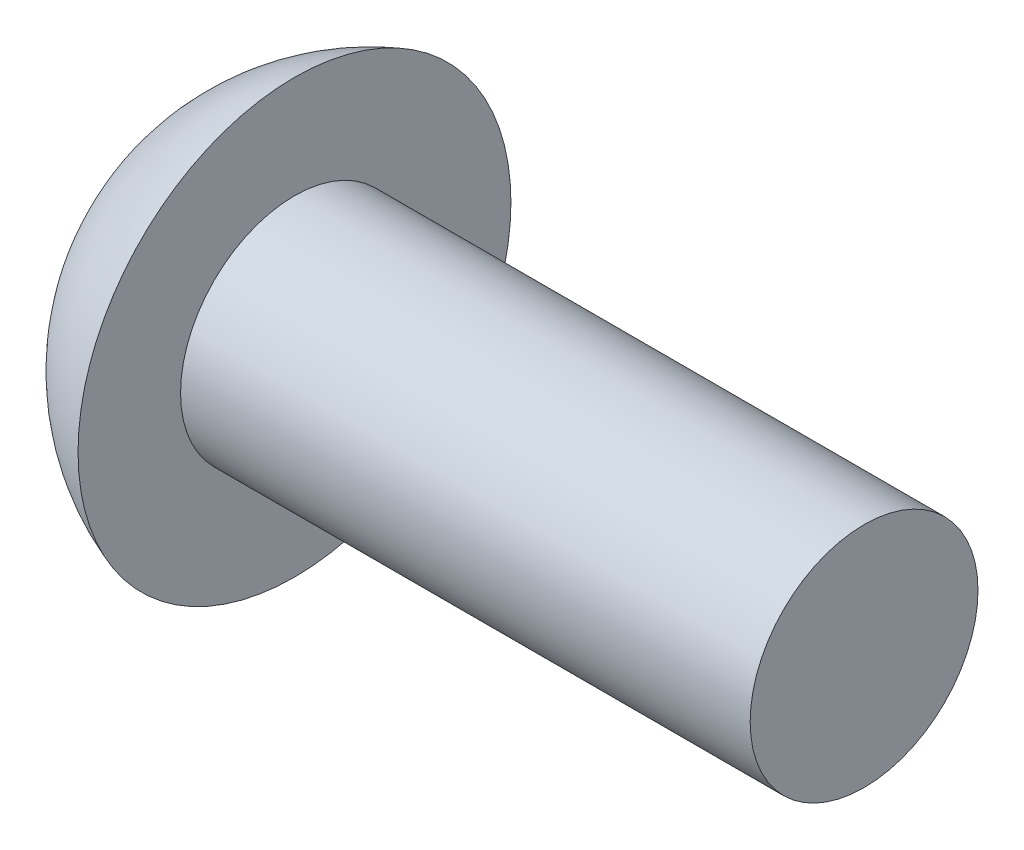
ISO-10303-21;
HEADER;
FILE_DESCRIPTION(('STEP AP214'),'2;1');
FILE_NAME('part.step','',(''),(''),'','','');
FILE_SCHEMA(('AUTOMOTIVE_DESIGN { 1 0 10303 214 1 1 1 1 }'));
ENDSEC;
DATA;
#1=APPLICATION_CONTEXT('core data for automotive mechanical design processes');
#2=APPLICATION_PROTOCOL_DEFINITION('international standard','automotive_design',2000,#1);
#3=PRODUCT_CONTEXT('',#1,'mechanical');
#4=PRODUCT('Part','Part','',(#3));
#5=PRODUCT_RELATED_PRODUCT_CATEGORY('part','',(#4));
#6=PRODUCT_DEFINITION_FORMATION('','',#4);
#7=PRODUCT_DEFINITION_CONTEXT('part definition',#1,'design');
#8=PRODUCT_DEFINITION('design','',#6,#7);
#9=PRODUCT_DEFINITION_SHAPE('','',#8);
#10=(LENGTH_UNIT() NAMED_UNIT(*) SI_UNIT(.MILLI.,.METRE.));
#11=(NAMED_UNIT(*) PLANE_ANGLE_UNIT() SI_UNIT($,.RADIAN.));
#12=(NAMED_UNIT(*) SI_UNIT($,.STERADIAN.) SOLID_ANGLE_UNIT());
#13=UNCERTAINTY_MEASURE_WITH_UNIT(LENGTH_MEASURE(1.E-05),#10,'distance_accuracy_value','');
#14=(GEOMETRIC_REPRESENTATION_CONTEXT(3) GLOBAL_UNCERTAINTY_ASSIGNED_CONTEXT((#13)) GLOBAL_UNIT_ASSIGNED_CONTEXT((#10,
#11,#12)) REPRESENTATION_CONTEXT('',''));
#15=CARTESIAN_POINT('',(0.,0.,0.));
#16=DIRECTION('',(0.,0.,1.));
#17=DIRECTION('',(1.,0.,0.));
#18=AXIS2_PLACEMENT_3D('',#15,#16,#17);
#19=CARTESIAN_POINT('',(0.,0.,0.));
#20=DIRECTION('',(1.,0.,0.));
#21=DIRECTION('',(0.,0.,-1.));
#22=AXIS2_PLACEMENT_3D('',#19,#20,#21);
#23=PLANE('',#22);
#24=CARTESIAN_POINT('',(0.,0.,0.));
#25=DIRECTION('',(-1.,0.,0.));
#26=DIRECTION('',(0.,0.,1.));
#27=AXIS2_PLACEMENT_3D('',#24,#25,#26);
#28=CIRCLE('',#27,1.935);
#29=CARTESIAN_POINT('',(0.,1.935,0.));
#30=VERTEX_POINT('',#29);
#31=EDGE_CURVE('E146',#30,#30,#28,.T.);
#32=ORIENTED_EDGE('',*,*,#31,.T.);
#33=EDGE_LOOP('',(#32));
#34=FACE_BOUND('',#33,.T.);
#35=DIRECTION('',(0.,0.866025403784439,-0.5));
#36=VECTOR('',#35,1.);
#37=CARTESIAN_POINT('',(0.,-1.25,-0.721687836487033));
#38=LINE('',#37,#36);
#39=CARTESIAN_POINT('',(0.,-1.25,-0.721687836487033));
#40=VERTEX_POINT('',#39);
#41=CARTESIAN_POINT('',(0.,0.,-1.44337567297406));
#42=VERTEX_POINT('',#41);
#43=EDGE_CURVE('E62',#40,#42,#38,.T.);
#44=ORIENTED_EDGE('',*,*,#43,.T.);
#45=DIRECTION('',(0.,0.866025403784438,0.5));
#46=VECTOR('',#45,1.);
#47=CARTESIAN_POINT('',(0.,0.,-1.44337567297406));
#48=LINE('',#47,#46);
#49=CARTESIAN_POINT('',(0.,1.25,-0.721687836487032));
#50=VERTEX_POINT('',#49);
#51=EDGE_CURVE('E125',#42,#50,#48,.T.);
#52=ORIENTED_EDGE('',*,*,#51,.T.);
#53=DIRECTION('',(0.,0.,1.));
#54=VECTOR('',#53,1.);
#55=CARTESIAN_POINT('',(0.,1.25,-0.721687836487032));
#56=LINE('',#55,#54);
#57=CARTESIAN_POINT('',(0.,1.25,0.721687836487032));
#58=VERTEX_POINT('',#57);
#59=EDGE_CURVE('E121',#50,#58,#56,.T.);
#60=ORIENTED_EDGE('',*,*,#59,.T.);
#61=DIRECTION('',(0.,-0.866025403784439,0.5));
#62=VECTOR('',#61,1.);
#63=CARTESIAN_POINT('',(0.,1.25,0.721687836487032));
#64=LINE('',#63,#62);
#65=CARTESIAN_POINT('',(0.,0.,1.44337567297406));
#66=VERTEX_POINT('',#65);
#67=EDGE_CURVE('E98',#58,#66,#64,.T.);
#68=ORIENTED_EDGE('',*,*,#67,.T.);
#69=DIRECTION('',(0.,-0.866025403784438,-0.5));
#70=VECTOR('',#69,1.);
#71=CARTESIAN_POINT('',(0.,0.,1.44337567297406));
#72=LINE('',#71,#70);
#73=CARTESIAN_POINT('',(0.,-1.25,0.721687836487032));
#74=VERTEX_POINT('',#73);
#75=EDGE_CURVE('E110',#66,#74,#72,.T.);
#76=ORIENTED_EDGE('',*,*,#75,.T.);
#77=DIRECTION('',(0.,0.,-1.));
#78=VECTOR('',#77,1.);
#79=CARTESIAN_POINT('',(0.,-1.25,0.721687836487032));
#80=LINE('',#79,#78);
#81=EDGE_CURVE('E117',#74,#40,#80,.T.);
#82=ORIENTED_EDGE('',*,*,#81,.T.);
#83=EDGE_LOOP('',(#44,#52,#60,#68,#76,#82));
#84=FACE_BOUND('',#83,.T.);
#85=ADVANCED_FACE('F47',(#34,#84),#23,.F.);
#86=CARTESIAN_POINT('',(2.2,0.,0.));
#87=DIRECTION('',(1.,0.,0.));
#88=DIRECTION('',(0.,0.,-1.));
#89=AXIS2_PLACEMENT_3D('',#86,#87,#88);
#90=PLANE('',#89);
#91=CARTESIAN_POINT('',(2.2,0.,0.));
#92=DIRECTION('',(-1.,0.,0.));
#93=DIRECTION('',(0.,0.,1.));
#94=AXIS2_PLACEMENT_3D('',#91,#92,#93);
#95=CIRCLE('',#94,3.8);
#96=CARTESIAN_POINT('',(2.2,3.8,0.));
#97=VERTEX_POINT('',#96);
#98=EDGE_CURVE('E150',#97,#97,#95,.T.);
#99=ORIENTED_EDGE('',*,*,#98,.F.);
#100=EDGE_LOOP('',(#99));
#101=FACE_BOUND('',#100,.T.);
#102=CARTESIAN_POINT('',(2.2,0.,0.));
#103=DIRECTION('',(1.,0.,0.));
#104=DIRECTION('',(0.,0.,-1.));
#105=AXIS2_PLACEMENT_3D('',#102,#103,#104);
#106=CIRCLE('',#105,2.);
#107=CARTESIAN_POINT('',(2.2,0.,-2.));
#108=VERTEX_POINT('',#107);
#109=EDGE_CURVE('E50',#108,#108,#106,.T.);
#110=ORIENTED_EDGE('',*,*,#109,.F.);
#111=EDGE_LOOP('',(#110));
#112=FACE_BOUND('',#111,.T.);
#113=ADVANCED_FACE('F162',(#101,#112),#90,.T.);
#114=CARTESIAN_POINT('',(12.2,0.,0.));
#115=DIRECTION('',(-1.,0.,0.));
#116=DIRECTION('',(0.,0.,1.));
#117=AXIS2_PLACEMENT_3D('',#114,#115,#116);
#118=CYLINDRICAL_SURFACE('',#117,2.);
#119=CARTESIAN_POINT('',(12.2,0.,0.));
#120=DIRECTION('',(1.,0.,0.));
#121=DIRECTION('',(0.,0.,-1.));
#122=AXIS2_PLACEMENT_3D('',#119,#120,#121);
#123=CIRCLE('',#122,2.);
#124=CARTESIAN_POINT('',(12.2,0.,-2.));
#125=VERTEX_POINT('',#124);
#126=EDGE_CURVE('E11',#125,#125,#123,.T.);
#127=ORIENTED_EDGE('',*,*,#126,.F.);
#128=EDGE_LOOP('',(#127));
#129=FACE_BOUND('',#128,.T.);
#130=ORIENTED_EDGE('',*,*,#109,.T.);
#131=EDGE_LOOP('',(#130));
#132=FACE_BOUND('',#131,.T.);
#133=ADVANCED_FACE('F160',(#129,#132),#118,.T.);
#134=CARTESIAN_POINT('',(12.2,0.,0.));
#135=DIRECTION('',(1.,0.,0.));
#136=DIRECTION('',(0.,0.,-1.));
#137=AXIS2_PLACEMENT_3D('',#134,#135,#136);
#138=PLANE('',#137);
#139=ORIENTED_EDGE('',*,*,#126,.T.);
#140=EDGE_LOOP('',(#139));
#141=FACE_BOUND('',#140,.T.);
#142=ADVANCED_FACE('F169',(#141),#138,.T.);
#143=CARTESIAN_POINT('',(3.53085795454545,0.,0.));
#144=DIRECTION('',(-1.,0.,0.));
#145=DIRECTION('',(0.,1.,0.));
#146=AXIS2_PLACEMENT_3D('',#143,#144,#145);
#147=SPHERICAL_SURFACE('',#146,4.02631132616157);
#148=CARTESIAN_POINT('',(2.2,3.8,0.));
#149=CARTESIAN_POINT('',(2.17100144801153,3.78984402970542,0.));
#150=CARTESIAN_POINT('',(2.14211919541206,3.77935599759403,0.));
#151=CARTESIAN_POINT('',(2.08460232361811,3.7577215785645,0.));
#152=CARTESIAN_POINT('',(2.05596770442362,3.74657519164638,0.));
#153=CARTESIAN_POINT('',(1.99896113406657,3.72362983183029,0.));
#154=CARTESIAN_POINT('',(1.97058918290401,3.71183085893233,0.));
#155=CARTESIAN_POINT('',(1.91412281080011,3.6875865304521,0.));
#156=CARTESIAN_POINT('',(1.88602838985876,3.67514117486983,0.));
#157=CARTESIAN_POINT('',(1.83013180425293,3.64961059830839,0.));
#158=CARTESIAN_POINT('',(1.80232963958845,3.63652537732922,0.));
#159=CARTESIAN_POINT('',(1.74703213692581,3.60972192924812,0.));
#160=CARTESIAN_POINT('',(1.71953679892765,3.59600370214618,0.));
#161=CARTESIAN_POINT('',(1.66486735985046,3.56794143106911,0.));
#162=CARTESIAN_POINT('',(1.63769325877142,3.55359738709397,0.));
#163=CARTESIAN_POINT('',(1.58368053524801,3.52429099998279,0.));
#164=CARTESIAN_POINT('',(1.55684191280364,3.50932865684675,0.));
#165=CARTESIAN_POINT('',(1.50351421249116,3.47879351304458,0.));
#166=CARTESIAN_POINT('',(1.47702513462305,3.46322071237846,0.));
#167=CARTESIAN_POINT('',(1.424410406198,3.4314728151176,0.));
#168=CARTESIAN_POINT('',(1.39828475564107,3.41529771852287,0.));
#169=CARTESIAN_POINT('',(1.34641057410705,3.38235370665615,0.));
#170=CARTESIAN_POINT('',(1.32066204312996,3.36558479138416,0.));
#171=CARTESIAN_POINT('',(1.2695555953777,3.33146193063284,0.));
#172=CARTESIAN_POINT('',(1.24419767860253,3.31410798515353,0.));
#173=CARTESIAN_POINT('',(1.19388574915827,3.27882415906704,0.));
#174=CARTESIAN_POINT('',(1.16893173648919,3.26089427845987,0.));
#175=CARTESIAN_POINT('',(1.11944069347796,3.22446797904081,0.));
#176=CARTESIAN_POINT('',(1.09490366313581,3.20597156022894,0.));
#177=CARTESIAN_POINT('',(1.04625944446182,3.16842187824223,0.));
#178=CARTESIAN_POINT('',(1.02215225612998,3.1493686150674,0.));
#179=CARTESIAN_POINT('',(0.974380355882842,3.11071523003474,0.));
#180=CARTESIAN_POINT('',(0.950715643967543,3.0911151081769,0.));
#181=CARTESIAN_POINT('',(0.90384109906097,3.05137827806292,0.));
#182=CARTESIAN_POINT('',(0.880631266069695,3.03124156980677,0.));
#183=CARTESIAN_POINT('',(0.834678643119837,2.99044212040198,0.));
#184=CARTESIAN_POINT('',(0.811935853161254,2.96977937925334,0.));
#185=CARTESIAN_POINT('',(0.766929235611514,2.92793869325948,0.));
#186=CARTESIAN_POINT('',(0.744665408020356,2.90676074841426,0.));
#187=CARTESIAN_POINT('',(0.700628383519414,2.86390075423776,0.));
#188=CARTESIAN_POINT('',(0.678855186609628,2.84221870490648,0.));
#189=CARTESIAN_POINT('',(0.635810834649362,2.79836186516596,0.));
#190=CARTESIAN_POINT('',(0.614539679598882,2.77618707475671,0.));
#191=CARTESIAN_POINT('',(0.572510559418424,2.73135637451051,0.));
#192=CARTESIAN_POINT('',(0.551752594288447,2.70870046467357,0.));
#193=CARTESIAN_POINT('',(0.510760733051605,2.66291939937317,0.));
#194=CARTESIAN_POINT('',(0.490526836944742,2.63979424390972,0.));
#195=CARTESIAN_POINT('',(0.450593718193615,2.59308680708714,0.));
#196=CARTESIAN_POINT('',(0.430894495549352,2.56950452572801,0.));
#197=CARTESIAN_POINT('',(0.392041047952828,2.5218951964164,0.));
#198=CARTESIAN_POINT('',(0.372886823000566,2.49786814846393,0.));
#199=CARTESIAN_POINT('',(0.335133409356377,2.4493818783853,0.));
#200=CARTESIAN_POINT('',(0.31653422066445,2.42492265625915,0.));
#201=CARTESIAN_POINT('',(0.279900627336809,2.37558485668395,0.));
#202=CARTESIAN_POINT('',(0.261866222701095,2.3507062792349,0.));
#203=CARTESIAN_POINT('',(0.226371648841653,2.30054280790069,0.));
#204=CARTESIAN_POINT('',(0.208911479617924,2.27525791401553,0.));
#205=CARTESIAN_POINT('',(0.174574528630597,2.22429506069232,0.));
#206=CARTESIAN_POINT('',(0.157697746867,2.19861710125426,0.));
#207=CARTESIAN_POINT('',(0.124536410959334,2.14688157726104,0.));
#208=CARTESIAN_POINT('',(0.108251856815265,2.12082401270588,0.));
#209=CARTESIAN_POINT('',(0.0762835288367869,2.06834292461481,0.));
#210=CARTESIAN_POINT('',(0.0605997550023769,2.0419194010789,0.));
#211=CARTESIAN_POINT('',(0.0298411399560801,1.98872028240066,0.));
#212=CARTESIAN_POINT('',(0.0147662987441934,1.96194468725834,0.));
#213=CARTESIAN_POINT('',(0.,1.935,0.));
#214=B_SPLINE_CURVE_WITH_KNOTS('',3,(#148,#149,#150,#151,#152,#153,#154,#155,#156,#157,#158,
#159,#160,#161,#162,#163,#164,#165,#166,#167,#168,#169,#170,#171,#172,#173,#174,#175,#176,#177,
#178,#179,#180,#181,#182,#183,#184,#185,#186,#187,#188,#189,#190,#191,#192,#193,#194,#195,#196,
#197,#198,#199,#200,#201,#202,#203,#204,#205,#206,#207,#208,#209,#210,#211,#212,#213),
.UNSPECIFIED.,.F.,.F.,(4,2,2,2,2,2,2,2,2,2,2,2,2,2,2,2,2,2,2,2,2,2,2,2,2,2,2,2,2,2,2,2,4),(0.,
0.0921746486151418,0.184349297230283,0.276523945845425,0.368698594460567,0.460873243075708,
0.55304789169085,0.645222540305992,0.737397188921133,0.829571837536275,0.921746486151417,
1.01392113476656,1.1060957833817,1.19827043199684,1.29044508061198,1.38261972922712,
1.47479437784227,1.56696902645741,1.65914367507255,1.75131832368769,1.84349297230283,
1.93566762091798,2.02784226953312,2.12001691814826,2.2121915667634,2.30436621537854,
2.39654086399368,2.48871551260882,2.58089016122397,2.67306480983911,2.76523945845425,
2.85741410706939,2.94958875568453),.UNSPECIFIED.);
#215=EDGE_CURVE('BSEAM176',#97,#30,#214,.T.);
#216=ORIENTED_EDGE('',*,*,#98,.T.);
#217=ORIENTED_EDGE('',*,*,#31,.F.);
#218=ORIENTED_EDGE('',*,*,#215,.T.);
#219=ORIENTED_EDGE('',*,*,#215,.F.);
#220=EDGE_LOOP('',(#216,#218,#217,#219));
#221=FACE_BOUND('',#220,.T.);
#222=ADVANCED_FACE('F176',(#221),#147,.T.);
#223=CARTESIAN_POINT('',(1.3,-1.25,-0.721687836487033));
#224=DIRECTION('',(0.,0.5,0.866025403784439));
#225=DIRECTION('',(0.,-0.866025403784439,0.5));
#226=AXIS2_PLACEMENT_3D('',#223,#224,#225);
#227=PLANE('',#226);
#228=ORIENTED_EDGE('',*,*,#43,.F.);
#229=DIRECTION('',(-1.,0.,0.));
#230=VECTOR('',#229,1.);
#231=CARTESIAN_POINT('',(1.3,-1.25,-0.721687836487033));
#232=LINE('',#231,#230);
#233=CARTESIAN_POINT('',(1.3,-1.25,-0.721687836487033));
#234=VERTEX_POINT('',#233);
#235=EDGE_CURVE('E132',#234,#40,#232,.T.);
#236=ORIENTED_EDGE('',*,*,#235,.F.);
#237=DIRECTION('',(0.,0.866025403784439,-0.5));
#238=VECTOR('',#237,1.);
#239=CARTESIAN_POINT('',(1.3,-1.25,-0.721687836487033));
#240=LINE('',#239,#238);
#241=CARTESIAN_POINT('',(1.3,0.,-1.44337567297406));
#242=VERTEX_POINT('',#241);
#243=EDGE_CURVE('E131',#234,#242,#240,.T.);
#244=ORIENTED_EDGE('',*,*,#243,.T.);
#245=DIRECTION('',(-1.,0.,0.));
#246=VECTOR('',#245,1.);
#247=CARTESIAN_POINT('',(1.3,0.,-1.44337567297406));
#248=LINE('',#247,#246);
#249=EDGE_CURVE('E143',#242,#42,#248,.T.);
#250=ORIENTED_EDGE('',*,*,#249,.T.);
#251=EDGE_LOOP('',(#228,#236,#244,#250));
#252=FACE_BOUND('',#251,.T.);
#253=ADVANCED_FACE('F180',(#252),#227,.T.);
#254=CARTESIAN_POINT('',(1.3,0.,-1.44337567297406));
#255=DIRECTION('',(0.,-0.5,0.866025403784438));
#256=DIRECTION('',(0.,-0.866025403784438,-0.5));
#257=AXIS2_PLACEMENT_3D('',#254,#255,#256);
#258=PLANE('',#257);
#259=ORIENTED_EDGE('',*,*,#51,.F.);
#260=ORIENTED_EDGE('',*,*,#249,.F.);
#261=DIRECTION('',(0.,0.866025403784438,0.5));
#262=VECTOR('',#261,1.);
#263=CARTESIAN_POINT('',(1.3,0.,-1.44337567297406));
#264=LINE('',#263,#262);
#265=CARTESIAN_POINT('',(1.3,1.25,-0.721687836487032));
#266=VERTEX_POINT('',#265);
#267=EDGE_CURVE('E257',#242,#266,#264,.T.);
#268=ORIENTED_EDGE('',*,*,#267,.T.);
#269=DIRECTION('',(-1.,0.,0.));
#270=VECTOR('',#269,1.);
#271=CARTESIAN_POINT('',(1.3,1.25,-0.721687836487032));
#272=LINE('',#271,#270);
#273=EDGE_CURVE('E140',#266,#50,#272,.T.);
#274=ORIENTED_EDGE('',*,*,#273,.T.);
#275=EDGE_LOOP('',(#259,#260,#268,#274));
#276=FACE_BOUND('',#275,.T.);
#277=ADVANCED_FACE('F183',(#276),#258,.T.);
#278=CARTESIAN_POINT('',(1.3,1.25,-0.721687836487032));
#279=DIRECTION('',(0.,-1.,0.));
#280=DIRECTION('',(0.,0.,-1.));
#281=AXIS2_PLACEMENT_3D('',#278,#279,#280);
#282=PLANE('',#281);
#283=ORIENTED_EDGE('',*,*,#59,.F.);
#284=ORIENTED_EDGE('',*,*,#273,.F.);
#285=DIRECTION('',(0.,0.,1.));
#286=VECTOR('',#285,1.);
#287=CARTESIAN_POINT('',(1.3,1.25,-0.721687836487032));
#288=LINE('',#287,#286);
#289=CARTESIAN_POINT('',(1.3,1.25,0.721687836487032));
#290=VERTEX_POINT('',#289);
#291=EDGE_CURVE('E71',#266,#290,#288,.T.);
#292=ORIENTED_EDGE('',*,*,#291,.T.);
#293=DIRECTION('',(-1.,0.,0.));
#294=VECTOR('',#293,1.);
#295=CARTESIAN_POINT('',(1.3,1.25,0.721687836487032));
#296=LINE('',#295,#294);
#297=EDGE_CURVE('E106',#290,#58,#296,.T.);
#298=ORIENTED_EDGE('',*,*,#297,.T.);
#299=EDGE_LOOP('',(#283,#284,#292,#298));
#300=FACE_BOUND('',#299,.T.);
#301=ADVANCED_FACE('F186',(#300),#282,.T.);
#302=CARTESIAN_POINT('',(1.3,1.25,0.721687836487032));
#303=DIRECTION('',(0.,-0.5,-0.866025403784439));
#304=DIRECTION('',(0.,0.866025403784439,-0.5));
#305=AXIS2_PLACEMENT_3D('',#302,#303,#304);
#306=PLANE('',#305);
#307=ORIENTED_EDGE('',*,*,#67,.F.);
#308=ORIENTED_EDGE('',*,*,#297,.F.);
#309=DIRECTION('',(0.,-0.866025403784439,0.5));
#310=VECTOR('',#309,1.);
#311=CARTESIAN_POINT('',(1.3,1.25,0.721687836487032));
#312=LINE('',#311,#310);
#313=CARTESIAN_POINT('',(1.3,0.,1.44337567297406));
#314=VERTEX_POINT('',#313);
#315=EDGE_CURVE('E102',#290,#314,#312,.T.);
#316=ORIENTED_EDGE('',*,*,#315,.T.);
#317=DIRECTION('',(-1.,0.,0.));
#318=VECTOR('',#317,1.);
#319=CARTESIAN_POINT('',(1.3,0.,1.44337567297406));
#320=LINE('',#319,#318);
#321=EDGE_CURVE('E93',#314,#66,#320,.T.);
#322=ORIENTED_EDGE('',*,*,#321,.T.);
#323=EDGE_LOOP('',(#307,#308,#316,#322));
#324=FACE_BOUND('',#323,.T.);
#325=ADVANCED_FACE('F95',(#324),#306,.T.);
#326=CARTESIAN_POINT('',(1.3,0.,1.44337567297406));
#327=DIRECTION('',(0.,0.5,-0.866025403784438));
#328=DIRECTION('',(0.,0.866025403784439,0.5));
#329=AXIS2_PLACEMENT_3D('',#326,#327,#328);
#330=PLANE('',#329);
#331=ORIENTED_EDGE('',*,*,#75,.F.);
#332=ORIENTED_EDGE('',*,*,#321,.F.);
#333=DIRECTION('',(0.,-0.866025403784438,-0.5));
#334=VECTOR('',#333,1.);
#335=CARTESIAN_POINT('',(1.3,0.,1.44337567297406));
#336=LINE('',#335,#334);
#337=CARTESIAN_POINT('',(1.3,-1.25,0.721687836487032));
#338=VERTEX_POINT('',#337);
#339=EDGE_CURVE('E226',#314,#338,#336,.T.);
#340=ORIENTED_EDGE('',*,*,#339,.T.);
#341=DIRECTION('',(-1.,0.,0.));
#342=VECTOR('',#341,1.);
#343=CARTESIAN_POINT('',(1.3,-1.25,0.721687836487032));
#344=LINE('',#343,#342);
#345=EDGE_CURVE('E107',#338,#74,#344,.T.);
#346=ORIENTED_EDGE('',*,*,#345,.T.);
#347=EDGE_LOOP('',(#331,#332,#340,#346));
#348=FACE_BOUND('',#347,.T.);
#349=ADVANCED_FACE('F111',(#348),#330,.T.);
#350=CARTESIAN_POINT('',(1.3,-1.25,0.721687836487032));
#351=DIRECTION('',(0.,1.,0.));
#352=DIRECTION('',(0.,0.,1.));
#353=AXIS2_PLACEMENT_3D('',#350,#351,#352);
#354=PLANE('',#353);
#355=ORIENTED_EDGE('',*,*,#81,.F.);
#356=ORIENTED_EDGE('',*,*,#345,.F.);
#357=DIRECTION('',(0.,0.,-1.));
#358=VECTOR('',#357,1.);
#359=CARTESIAN_POINT('',(1.3,-1.25,0.721687836487032));
#360=LINE('',#359,#358);
#361=EDGE_CURVE('E135',#338,#234,#360,.T.);
#362=ORIENTED_EDGE('',*,*,#361,.T.);
#363=ORIENTED_EDGE('',*,*,#235,.T.);
#364=EDGE_LOOP('',(#355,#356,#362,#363));
#365=FACE_BOUND('',#364,.T.);
#366=ADVANCED_FACE('F195',(#365),#354,.T.);
#367=CARTESIAN_POINT('',(1.3,0.,1.44337567297406));
#368=DIRECTION('',(0.86602540378444,-0.249999999999999,0.433012701892218));
#369=DIRECTION('',(0.447213595499956,0.,-0.894427190999917));
#370=AXIS2_PLACEMENT_3D('',#367,#368,#369);
#371=PLANE('',#370);
#372=ORIENTED_EDGE('',*,*,#339,.F.);
#373=DIRECTION('',(-0.447213595499956,0.,0.894427190999917));
#374=VECTOR('',#373,1.);
#375=CARTESIAN_POINT('',(1.3,0.,1.44337567297406));
#376=LINE('',#375,#374);
#377=CARTESIAN_POINT('',(2.02168783648703,0.,0.));
#378=VERTEX_POINT('',#377);
#379=EDGE_CURVE('E228',#378,#314,#376,.T.);
#380=ORIENTED_EDGE('',*,*,#379,.F.);
#381=DIRECTION('',(-0.447213595499956,-0.774596669241484,0.447213595499958));
#382=VECTOR('',#381,1.);
#383=CARTESIAN_POINT('',(1.3,-1.25,0.721687836487032));
#384=LINE('',#383,#382);
#385=EDGE_CURVE('E231',#378,#338,#384,.T.);
#386=ORIENTED_EDGE('',*,*,#385,.T.);
#387=EDGE_LOOP('',(#372,#380,#386));
#388=FACE_BOUND('',#387,.T.);
#389=ADVANCED_FACE('F198',(#388),#371,.F.);
#390=CARTESIAN_POINT('',(1.3,-1.25,0.721687836487032));
#391=DIRECTION('',(0.86602540378444,-0.499999999999998,0.));
#392=DIRECTION('',(0.499999999999998,0.86602540378444,0.));
#393=AXIS2_PLACEMENT_3D('',#390,#391,#392);
#394=PLANE('',#393);
#395=ORIENTED_EDGE('',*,*,#361,.F.);
#396=ORIENTED_EDGE('',*,*,#385,.F.);
#397=DIRECTION('',(-0.447213595499956,-0.774596669241484,-0.447213595499958));
#398=VECTOR('',#397,1.);
#399=CARTESIAN_POINT('',(1.3,-1.25,-0.721687836487033));
#400=LINE('',#399,#398);
#401=EDGE_CURVE('E262',#378,#234,#400,.T.);
#402=ORIENTED_EDGE('',*,*,#401,.T.);
#403=EDGE_LOOP('',(#395,#396,#402));
#404=FACE_BOUND('',#403,.T.);
#405=ADVANCED_FACE('F200',(#404),#394,.F.);
#406=CARTESIAN_POINT('',(1.3,-1.25,-0.721687836487033));
#407=DIRECTION('',(0.86602540378444,-0.249999999999999,-0.433012701892218));
#408=DIRECTION('',(-0.447213595499956,0.,-0.894427190999917));
#409=AXIS2_PLACEMENT_3D('',#406,#407,#408);
#410=PLANE('',#409);
#411=ORIENTED_EDGE('',*,*,#243,.F.);
#412=ORIENTED_EDGE('',*,*,#401,.F.);
#413=DIRECTION('',(-0.447213595499956,0.,-0.894427190999917));
#414=VECTOR('',#413,1.);
#415=CARTESIAN_POINT('',(1.3,0.,-1.44337567297406));
#416=LINE('',#415,#414);
#417=EDGE_CURVE('E271',#378,#242,#416,.T.);
#418=ORIENTED_EDGE('',*,*,#417,.T.);
#419=EDGE_LOOP('',(#411,#412,#418));
#420=FACE_BOUND('',#419,.T.);
#421=ADVANCED_FACE('F203',(#420),#410,.F.);
#422=CARTESIAN_POINT('',(1.3,0.,-1.44337567297406));
#423=DIRECTION('',(0.86602540378444,0.249999999999999,-0.433012701892217));
#424=DIRECTION('',(-0.447213595499956,0.,-0.894427190999917));
#425=AXIS2_PLACEMENT_3D('',#422,#423,#424);
#426=PLANE('',#425);
#427=ORIENTED_EDGE('',*,*,#267,.F.);
#428=ORIENTED_EDGE('',*,*,#417,.F.);
#429=DIRECTION('',(-0.447213595499956,0.774596669241484,-0.447213595499958));
#430=VECTOR('',#429,1.);
#431=CARTESIAN_POINT('',(1.3,1.25,-0.721687836487032));
#432=LINE('',#431,#430);
#433=EDGE_CURVE('E274',#378,#266,#432,.T.);
#434=ORIENTED_EDGE('',*,*,#433,.T.);
#435=EDGE_LOOP('',(#427,#428,#434));
#436=FACE_BOUND('',#435,.T.);
#437=ADVANCED_FACE('F207',(#436),#426,.F.);
#438=CARTESIAN_POINT('',(1.3,1.25,-0.721687836487032));
#439=DIRECTION('',(0.86602540378444,0.499999999999998,0.));
#440=DIRECTION('',(-0.499999999999998,0.86602540378444,0.));
#441=AXIS2_PLACEMENT_3D('',#438,#439,#440);
#442=PLANE('',#441);
#443=ORIENTED_EDGE('',*,*,#291,.F.);
#444=ORIENTED_EDGE('',*,*,#433,.F.);
#445=DIRECTION('',(-0.447213595499956,0.774596669241484,0.447213595499958));
#446=VECTOR('',#445,1.);
#447=CARTESIAN_POINT('',(1.3,1.25,0.721687836487032));
#448=LINE('',#447,#446);
#449=EDGE_CURVE('E267',#378,#290,#448,.T.);
#450=ORIENTED_EDGE('',*,*,#449,.T.);
#451=EDGE_LOOP('',(#443,#444,#450));
#452=FACE_BOUND('',#451,.T.);
#453=ADVANCED_FACE('F211',(#452),#442,.F.);
#454=CARTESIAN_POINT('',(1.3,1.25,0.721687836487032));
#455=DIRECTION('',(0.86602540378444,0.249999999999999,0.433012701892218));
#456=DIRECTION('',(0.447213595499956,0.,-0.894427190999917));
#457=AXIS2_PLACEMENT_3D('',#454,#455,#456);
#458=PLANE('',#457);
#459=ORIENTED_EDGE('',*,*,#315,.F.);
#460=ORIENTED_EDGE('',*,*,#449,.F.);
#461=ORIENTED_EDGE('',*,*,#379,.T.);
#462=EDGE_LOOP('',(#459,#460,#461));
#463=FACE_BOUND('',#462,.T.);
#464=ADVANCED_FACE('F215',(#463),#458,.F.);
#465=CLOSED_SHELL('',(#85,#113,#133,#142,#222,#253,#277,#301,#325,#349,#366,#389,#405,#421,#437,
#453,#464));
#466=MANIFOLD_SOLID_BREP('B2',#465);
#467=ADVANCED_BREP_SHAPE_REPRESENTATION('',(#18,#466),#14);
#468=SHAPE_DEFINITION_REPRESENTATION(#9,#467);
ENDSEC;
END-ISO-10303-21;
